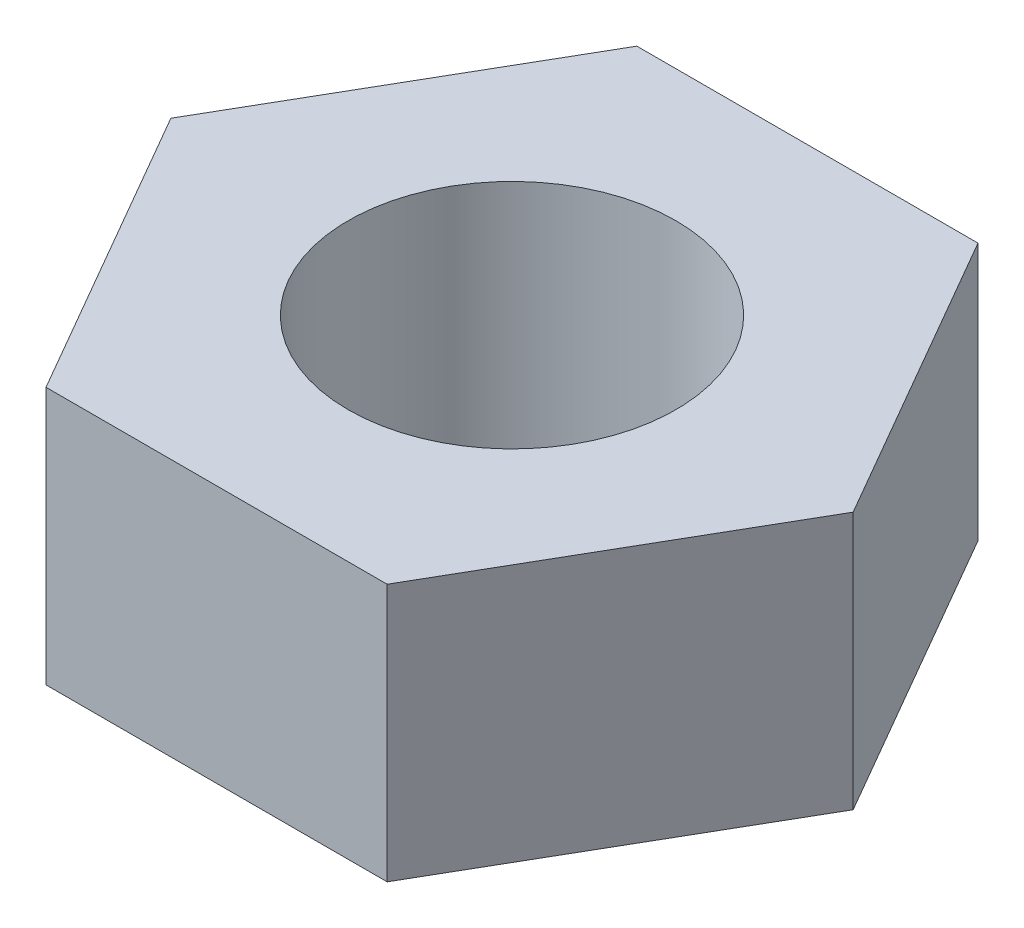
ISO-10303-21;
HEADER;
FILE_DESCRIPTION(('STEP AP214'),'2;1');
FILE_NAME('part.step','',(''),(''),'','','');
FILE_SCHEMA(('AUTOMOTIVE_DESIGN { 1 0 10303 214 1 1 1 1 }'));
ENDSEC;
DATA;
#1=APPLICATION_CONTEXT('core data for automotive mechanical design processes');
#2=APPLICATION_PROTOCOL_DEFINITION('international standard','automotive_design',2000,#1);
#3=PRODUCT_CONTEXT('',#1,'mechanical');
#4=PRODUCT('Part','Part','',(#3));
#5=PRODUCT_RELATED_PRODUCT_CATEGORY('part','',(#4));
#6=PRODUCT_DEFINITION_FORMATION('','',#4);
#7=PRODUCT_DEFINITION_CONTEXT('part definition',#1,'design');
#8=PRODUCT_DEFINITION('design','',#6,#7);
#9=PRODUCT_DEFINITION_SHAPE('','',#8);
#10=(LENGTH_UNIT() NAMED_UNIT(*) SI_UNIT(.MILLI.,.METRE.));
#11=(NAMED_UNIT(*) PLANE_ANGLE_UNIT() SI_UNIT($,.RADIAN.));
#12=(NAMED_UNIT(*) SI_UNIT($,.STERADIAN.) SOLID_ANGLE_UNIT());
#13=UNCERTAINTY_MEASURE_WITH_UNIT(LENGTH_MEASURE(1.E-05),#10,'distance_accuracy_value','');
#14=(GEOMETRIC_REPRESENTATION_CONTEXT(3) GLOBAL_UNCERTAINTY_ASSIGNED_CONTEXT((#13)) GLOBAL_UNIT_ASSIGNED_CONTEXT((#10,
#11,#12)) REPRESENTATION_CONTEXT('',''));
#15=CARTESIAN_POINT('',(0.,0.,0.));
#16=DIRECTION('',(0.,0.,1.));
#17=DIRECTION('',(1.,0.,0.));
#18=AXIS2_PLACEMENT_3D('',#15,#16,#17);
#19=CARTESIAN_POINT('',(0.,2.36,0.));
#20=DIRECTION('',(0.,1.,0.));
#21=DIRECTION('',(0.,0.,1.));
#22=AXIS2_PLACEMENT_3D('',#19,#20,#21);
#23=PLANE('',#22);
#24=DIRECTION('',(0.499999999999995,0.,-0.866025403784442));
#25=VECTOR('',#24,1.);
#26=CARTESIAN_POINT('',(1.56173247815793,2.36,2.70500000000005));
#27=LINE('',#26,#25);
#28=CARTESIAN_POINT('',(1.56173247815793,2.36,2.70500000000005));
#29=VERTEX_POINT('',#28);
#30=CARTESIAN_POINT('',(3.12346495631588,2.36,0.));
#31=VERTEX_POINT('',#30);
#32=EDGE_CURVE('E133',#29,#31,#27,.T.);
#33=ORIENTED_EDGE('',*,*,#32,.T.);
#34=DIRECTION('',(-0.500000000000015,0.,-0.86602540378443));
#35=VECTOR('',#34,1.);
#36=CARTESIAN_POINT('',(3.12346495631588,2.36,0.));
#37=LINE('',#36,#35);
#38=CARTESIAN_POINT('',(1.5617324781579,2.36,-2.70499999999996));
#39=VERTEX_POINT('',#38);
#40=EDGE_CURVE('E91',#31,#39,#37,.T.);
#41=ORIENTED_EDGE('',*,*,#40,.T.);
#42=DIRECTION('',(-1.,0.,0.));
#43=VECTOR('',#42,1.);
#44=CARTESIAN_POINT('',(1.5617324781579,2.36,-2.70499999999996));
#45=LINE('',#44,#43);
#46=CARTESIAN_POINT('',(-1.56173247815798,2.36,-2.70499999999996));
#47=VERTEX_POINT('',#46);
#48=EDGE_CURVE('E104',#39,#47,#45,.T.);
#49=ORIENTED_EDGE('',*,*,#48,.T.);
#50=DIRECTION('',(-0.499999999999995,0.,0.866025403784441));
#51=VECTOR('',#50,1.);
#52=CARTESIAN_POINT('',(-1.56173247815798,2.36,-2.70499999999996));
#53=LINE('',#52,#51);
#54=CARTESIAN_POINT('',(-3.12346495631588,2.36,0.));
#55=VERTEX_POINT('',#54);
#56=EDGE_CURVE('E98',#47,#55,#53,.T.);
#57=ORIENTED_EDGE('',*,*,#56,.T.);
#58=DIRECTION('',(0.5,0.,0.866025403784439));
#59=VECTOR('',#58,1.);
#60=CARTESIAN_POINT('',(-3.12346495631588,2.36,0.));
#61=LINE('',#60,#59);
#62=CARTESIAN_POINT('',(-1.56173247815794,2.36,2.705));
#63=VERTEX_POINT('',#62);
#64=EDGE_CURVE('E102',#55,#63,#61,.T.);
#65=ORIENTED_EDGE('',*,*,#64,.T.);
#66=DIRECTION('',(1.,0.,0.));
#67=VECTOR('',#66,1.);
#68=CARTESIAN_POINT('',(-1.56173247815794,2.36,2.705));
#69=LINE('',#68,#67);
#70=EDGE_CURVE('E54',#63,#29,#69,.T.);
#71=ORIENTED_EDGE('',*,*,#70,.T.);
#72=EDGE_LOOP('',(#33,#41,#49,#57,#65,#71));
#73=FACE_BOUND('',#72,.T.);
#74=CARTESIAN_POINT('',(0.,2.36,0.));
#75=DIRECTION('',(0.,1.,0.));
#76=DIRECTION('',(0.,0.,1.));
#77=AXIS2_PLACEMENT_3D('',#74,#75,#76);
#78=CIRCLE('',#77,1.5);
#79=CARTESIAN_POINT('',(0.,2.36,-1.5));
#80=VERTEX_POINT('',#79);
#81=EDGE_CURVE('E126',#80,#80,#78,.T.);
#82=ORIENTED_EDGE('',*,*,#81,.F.);
#83=EDGE_LOOP('',(#82));
#84=FACE_BOUND('',#83,.T.);
#85=ADVANCED_FACE('F37',(#73,#84),#23,.T.);
#86=CARTESIAN_POINT('',(0.,0.,0.));
#87=DIRECTION('',(0.,1.,0.));
#88=DIRECTION('',(0.,0.,1.));
#89=AXIS2_PLACEMENT_3D('',#86,#87,#88);
#90=PLANE('',#89);
#91=DIRECTION('',(0.499999999999995,0.,-0.866025403784442));
#92=VECTOR('',#91,1.);
#93=CARTESIAN_POINT('',(1.56173247815793,0.,2.70500000000005));
#94=LINE('',#93,#92);
#95=CARTESIAN_POINT('',(1.56173247815793,0.,2.70500000000005));
#96=VERTEX_POINT('',#95);
#97=CARTESIAN_POINT('',(3.12346495631588,0.,0.));
#98=VERTEX_POINT('',#97);
#99=EDGE_CURVE('E122',#96,#98,#94,.T.);
#100=ORIENTED_EDGE('',*,*,#99,.F.);
#101=DIRECTION('',(1.,0.,0.));
#102=VECTOR('',#101,1.);
#103=CARTESIAN_POINT('',(-1.56173247815794,0.,2.705));
#104=LINE('',#103,#102);
#105=CARTESIAN_POINT('',(-1.56173247815794,0.,2.705));
#106=VERTEX_POINT('',#105);
#107=EDGE_CURVE('E83',#106,#96,#104,.T.);
#108=ORIENTED_EDGE('',*,*,#107,.F.);
#109=DIRECTION('',(0.5,0.,0.866025403784439));
#110=VECTOR('',#109,1.);
#111=CARTESIAN_POINT('',(-3.12346495631588,0.,0.));
#112=LINE('',#111,#110);
#113=CARTESIAN_POINT('',(-3.12346495631588,0.,0.));
#114=VERTEX_POINT('',#113);
#115=EDGE_CURVE('E77',#114,#106,#112,.T.);
#116=ORIENTED_EDGE('',*,*,#115,.F.);
#117=DIRECTION('',(-0.499999999999995,0.,0.866025403784441));
#118=VECTOR('',#117,1.);
#119=CARTESIAN_POINT('',(-1.56173247815798,0.,-2.70499999999996));
#120=LINE('',#119,#118);
#121=CARTESIAN_POINT('',(-1.56173247815798,0.,-2.70499999999996));
#122=VERTEX_POINT('',#121);
#123=EDGE_CURVE('E112',#122,#114,#120,.T.);
#124=ORIENTED_EDGE('',*,*,#123,.F.);
#125=DIRECTION('',(-1.,0.,0.));
#126=VECTOR('',#125,1.);
#127=CARTESIAN_POINT('',(1.5617324781579,0.,-2.70499999999996));
#128=LINE('',#127,#126);
#129=CARTESIAN_POINT('',(1.5617324781579,0.,-2.70499999999996));
#130=VERTEX_POINT('',#129);
#131=EDGE_CURVE('E128',#130,#122,#128,.T.);
#132=ORIENTED_EDGE('',*,*,#131,.F.);
#133=DIRECTION('',(-0.500000000000015,0.,-0.86602540378443));
#134=VECTOR('',#133,1.);
#135=CARTESIAN_POINT('',(3.12346495631588,0.,0.));
#136=LINE('',#135,#134);
#137=EDGE_CURVE('E125',#98,#130,#136,.T.);
#138=ORIENTED_EDGE('',*,*,#137,.F.);
#139=EDGE_LOOP('',(#100,#108,#116,#124,#132,#138));
#140=FACE_BOUND('',#139,.T.);
#141=CARTESIAN_POINT('',(0.,0.,0.));
#142=DIRECTION('',(0.,1.,0.));
#143=DIRECTION('',(0.,0.,1.));
#144=AXIS2_PLACEMENT_3D('',#141,#142,#143);
#145=CIRCLE('',#144,1.5);
#146=CARTESIAN_POINT('',(0.,0.,-1.5));
#147=VERTEX_POINT('',#146);
#148=EDGE_CURVE('E244',#147,#147,#145,.T.);
#149=ORIENTED_EDGE('',*,*,#148,.T.);
#150=EDGE_LOOP('',(#149));
#151=FACE_BOUND('',#150,.T.);
#152=ADVANCED_FACE('F142',(#140,#151),#90,.F.);
#153=CARTESIAN_POINT('',(1.56173247815793,2.36,2.70500000000005));
#154=DIRECTION('',(-0.866025403784441,0.,-0.499999999999995));
#155=DIRECTION('',(-0.499999999999995,0.,0.866025403784441));
#156=AXIS2_PLACEMENT_3D('',#153,#154,#155);
#157=PLANE('',#156);
#158=ORIENTED_EDGE('',*,*,#99,.T.);
#159=DIRECTION('',(0.,-1.,0.));
#160=VECTOR('',#159,1.);
#161=CARTESIAN_POINT('',(3.12346495631588,2.36,0.));
#162=LINE('',#161,#160);
#163=EDGE_CURVE('E11',#31,#98,#162,.T.);
#164=ORIENTED_EDGE('',*,*,#163,.F.);
#165=ORIENTED_EDGE('',*,*,#32,.F.);
#166=DIRECTION('',(0.,-1.,0.));
#167=VECTOR('',#166,1.);
#168=CARTESIAN_POINT('',(1.56173247815793,2.36,2.70500000000005));
#169=LINE('',#168,#167);
#170=EDGE_CURVE('E118',#29,#96,#169,.T.);
#171=ORIENTED_EDGE('',*,*,#170,.T.);
#172=EDGE_LOOP('',(#158,#164,#165,#171));
#173=FACE_BOUND('',#172,.T.);
#174=ADVANCED_FACE('F39',(#173),#157,.F.);
#175=CARTESIAN_POINT('',(3.12346495631588,2.36,0.));
#176=DIRECTION('',(-0.86602540378443,0.,0.500000000000015));
#177=DIRECTION('',(0.500000000000015,0.,0.86602540378443));
#178=AXIS2_PLACEMENT_3D('',#175,#176,#177);
#179=PLANE('',#178);
#180=ORIENTED_EDGE('',*,*,#137,.T.);
#181=DIRECTION('',(0.,-1.,0.));
#182=VECTOR('',#181,1.);
#183=CARTESIAN_POINT('',(1.5617324781579,2.36,-2.70499999999996));
#184=LINE('',#183,#182);
#185=EDGE_CURVE('E46',#39,#130,#184,.T.);
#186=ORIENTED_EDGE('',*,*,#185,.F.);
#187=ORIENTED_EDGE('',*,*,#40,.F.);
#188=ORIENTED_EDGE('',*,*,#163,.T.);
#189=EDGE_LOOP('',(#180,#186,#187,#188));
#190=FACE_BOUND('',#189,.T.);
#191=ADVANCED_FACE('F167',(#190),#179,.F.);
#192=CARTESIAN_POINT('',(1.5617324781579,2.36,-2.70499999999996));
#193=DIRECTION('',(0.,0.,1.));
#194=DIRECTION('',(1.,0.,0.));
#195=AXIS2_PLACEMENT_3D('',#192,#193,#194);
#196=PLANE('',#195);
#197=ORIENTED_EDGE('',*,*,#131,.T.);
#198=DIRECTION('',(0.,-1.,0.));
#199=VECTOR('',#198,1.);
#200=CARTESIAN_POINT('',(-1.56173247815798,2.36,-2.70499999999996));
#201=LINE('',#200,#199);
#202=EDGE_CURVE('E113',#47,#122,#201,.T.);
#203=ORIENTED_EDGE('',*,*,#202,.F.);
#204=ORIENTED_EDGE('',*,*,#48,.F.);
#205=ORIENTED_EDGE('',*,*,#185,.T.);
#206=EDGE_LOOP('',(#197,#203,#204,#205));
#207=FACE_BOUND('',#206,.T.);
#208=ADVANCED_FACE('F139',(#207),#196,.F.);
#209=CARTESIAN_POINT('',(-1.56173247815798,2.36,-2.70499999999996));
#210=DIRECTION('',(0.866025403784441,0.,0.499999999999995));
#211=DIRECTION('',(0.499999999999995,0.,-0.866025403784441));
#212=AXIS2_PLACEMENT_3D('',#209,#210,#211);
#213=PLANE('',#212);
#214=ORIENTED_EDGE('',*,*,#123,.T.);
#215=DIRECTION('',(0.,-1.,0.));
#216=VECTOR('',#215,1.);
#217=CARTESIAN_POINT('',(-3.12346495631588,2.36,0.));
#218=LINE('',#217,#216);
#219=EDGE_CURVE('E109',#55,#114,#218,.T.);
#220=ORIENTED_EDGE('',*,*,#219,.F.);
#221=ORIENTED_EDGE('',*,*,#56,.F.);
#222=ORIENTED_EDGE('',*,*,#202,.T.);
#223=EDGE_LOOP('',(#214,#220,#221,#222));
#224=FACE_BOUND('',#223,.T.);
#225=ADVANCED_FACE('F110',(#224),#213,.F.);
#226=CARTESIAN_POINT('',(-3.12346495631588,2.36,0.));
#227=DIRECTION('',(0.866025403784439,0.,-0.5));
#228=DIRECTION('',(-0.5,0.,-0.866025403784439));
#229=AXIS2_PLACEMENT_3D('',#226,#227,#228);
#230=PLANE('',#229);
#231=ORIENTED_EDGE('',*,*,#115,.T.);
#232=DIRECTION('',(0.,-1.,0.));
#233=VECTOR('',#232,1.);
#234=CARTESIAN_POINT('',(-1.56173247815794,2.36,2.705));
#235=LINE('',#234,#233);
#236=EDGE_CURVE('E114',#63,#106,#235,.T.);
#237=ORIENTED_EDGE('',*,*,#236,.F.);
#238=ORIENTED_EDGE('',*,*,#64,.F.);
#239=ORIENTED_EDGE('',*,*,#219,.T.);
#240=EDGE_LOOP('',(#231,#237,#238,#239));
#241=FACE_BOUND('',#240,.T.);
#242=ADVANCED_FACE('F116',(#241),#230,.F.);
#243=CARTESIAN_POINT('',(-1.56173247815794,2.36,2.705));
#244=DIRECTION('',(0.,0.,-1.));
#245=DIRECTION('',(-1.,0.,0.));
#246=AXIS2_PLACEMENT_3D('',#243,#244,#245);
#247=PLANE('',#246);
#248=ORIENTED_EDGE('',*,*,#107,.T.);
#249=ORIENTED_EDGE('',*,*,#170,.F.);
#250=ORIENTED_EDGE('',*,*,#70,.F.);
#251=ORIENTED_EDGE('',*,*,#236,.T.);
#252=EDGE_LOOP('',(#248,#249,#250,#251));
#253=FACE_BOUND('',#252,.T.);
#254=ADVANCED_FACE('F147',(#253),#247,.F.);
#255=CARTESIAN_POINT('',(0.,2.36,0.));
#256=DIRECTION('',(0.,-1.,0.));
#257=DIRECTION('',(0.,0.,-1.));
#258=AXIS2_PLACEMENT_3D('',#255,#256,#257);
#259=CYLINDRICAL_SURFACE('',#258,1.5);
#260=CARTESIAN_POINT('',(0.,2.36,-1.5));
#261=CARTESIAN_POINT('',(0.,2.33541666666667,-1.5));
#262=CARTESIAN_POINT('',(0.,2.31083333333333,-1.5));
#263=CARTESIAN_POINT('',(0.,2.26166666666667,-1.5));
#264=CARTESIAN_POINT('',(0.,2.23708333333333,-1.5));
#265=CARTESIAN_POINT('',(0.,2.18791666666667,-1.5));
#266=CARTESIAN_POINT('',(0.,2.16333333333333,-1.5));
#267=CARTESIAN_POINT('',(0.,2.11416666666667,-1.5));
#268=CARTESIAN_POINT('',(0.,2.08958333333333,-1.5));
#269=CARTESIAN_POINT('',(0.,2.04041666666667,-1.5));
#270=CARTESIAN_POINT('',(0.,2.01583333333333,-1.5));
#271=CARTESIAN_POINT('',(0.,1.96666666666667,-1.5));
#272=CARTESIAN_POINT('',(0.,1.94208333333333,-1.5));
#273=CARTESIAN_POINT('',(0.,1.89291666666667,-1.5));
#274=CARTESIAN_POINT('',(0.,1.86833333333333,-1.5));
#275=CARTESIAN_POINT('',(0.,1.81916666666667,-1.5));
#276=CARTESIAN_POINT('',(0.,1.79458333333333,-1.5));
#277=CARTESIAN_POINT('',(0.,1.74541666666667,-1.5));
#278=CARTESIAN_POINT('',(0.,1.72083333333333,-1.5));
#279=CARTESIAN_POINT('',(0.,1.67166666666667,-1.5));
#280=CARTESIAN_POINT('',(0.,1.64708333333333,-1.5));
#281=CARTESIAN_POINT('',(0.,1.59791666666667,-1.5));
#282=CARTESIAN_POINT('',(0.,1.57333333333333,-1.5));
#283=CARTESIAN_POINT('',(0.,1.52416666666667,-1.5));
#284=CARTESIAN_POINT('',(0.,1.49958333333333,-1.5));
#285=CARTESIAN_POINT('',(0.,1.45041666666667,-1.5));
#286=CARTESIAN_POINT('',(0.,1.42583333333333,-1.5));
#287=CARTESIAN_POINT('',(0.,1.37666666666667,-1.5));
#288=CARTESIAN_POINT('',(0.,1.35208333333333,-1.5));
#289=CARTESIAN_POINT('',(0.,1.30291666666667,-1.5));
#290=CARTESIAN_POINT('',(0.,1.27833333333333,-1.5));
#291=CARTESIAN_POINT('',(0.,1.22916666666667,-1.5));
#292=CARTESIAN_POINT('',(0.,1.20458333333333,-1.5));
#293=CARTESIAN_POINT('',(0.,1.15541666666667,-1.5));
#294=CARTESIAN_POINT('',(0.,1.13083333333333,-1.5));
#295=CARTESIAN_POINT('',(0.,1.08166666666667,-1.5));
#296=CARTESIAN_POINT('',(0.,1.05708333333333,-1.5));
#297=CARTESIAN_POINT('',(0.,1.00791666666667,-1.5));
#298=CARTESIAN_POINT('',(0.,0.983333333333333,-1.5));
#299=CARTESIAN_POINT('',(0.,0.934166666666667,-1.5));
#300=CARTESIAN_POINT('',(0.,0.909583333333333,-1.5));
#301=CARTESIAN_POINT('',(0.,0.860416666666667,-1.5));
#302=CARTESIAN_POINT('',(0.,0.835833333333333,-1.5));
#303=CARTESIAN_POINT('',(0.,0.786666666666667,-1.5));
#304=CARTESIAN_POINT('',(0.,0.762083333333333,-1.5));
#305=CARTESIAN_POINT('',(0.,0.712916666666667,-1.5));
#306=CARTESIAN_POINT('',(0.,0.688333333333333,-1.5));
#307=CARTESIAN_POINT('',(0.,0.639166666666666,-1.5));
#308=CARTESIAN_POINT('',(0.,0.614583333333333,-1.5));
#309=CARTESIAN_POINT('',(0.,0.565416666666666,-1.5));
#310=CARTESIAN_POINT('',(0.,0.540833333333333,-1.5));
#311=CARTESIAN_POINT('',(0.,0.491666666666666,-1.5));
#312=CARTESIAN_POINT('',(0.,0.467083333333333,-1.5));
#313=CARTESIAN_POINT('',(0.,0.417916666666667,-1.5));
#314=CARTESIAN_POINT('',(0.,0.393333333333333,-1.5));
#315=CARTESIAN_POINT('',(0.,0.344166666666667,-1.5));
#316=CARTESIAN_POINT('',(0.,0.319583333333333,-1.5));
#317=CARTESIAN_POINT('',(0.,0.270416666666667,-1.5));
#318=CARTESIAN_POINT('',(0.,0.245833333333333,-1.5));
#319=CARTESIAN_POINT('',(0.,0.196666666666667,-1.5));
#320=CARTESIAN_POINT('',(0.,0.172083333333333,-1.5));
#321=CARTESIAN_POINT('',(0.,0.122916666666667,-1.5));
#322=CARTESIAN_POINT('',(0.,0.0983333333333334,-1.5));
#323=CARTESIAN_POINT('',(0.,0.0491666666666667,-1.5));
#324=CARTESIAN_POINT('',(0.,0.0245833333333333,-1.5));
#325=CARTESIAN_POINT('',(0.,0.,-1.5));
#326=B_SPLINE_CURVE_WITH_KNOTS('',3,(#260,#261,#262,#263,#264,#265,#266,#267,#268,#269,#270,
#271,#272,#273,#274,#275,#276,#277,#278,#279,#280,#281,#282,#283,#284,#285,#286,#287,#288,#289,
#290,#291,#292,#293,#294,#295,#296,#297,#298,#299,#300,#301,#302,#303,#304,#305,#306,#307,#308,
#309,#310,#311,#312,#313,#314,#315,#316,#317,#318,#319,#320,#321,#322,#323,#324,#325),
.UNSPECIFIED.,.F.,.F.,(4,2,2,2,2,2,2,2,2,2,2,2,2,2,2,2,2,2,2,2,2,2,2,2,2,2,2,2,2,2,2,2,4),(0.,
0.07375,0.1475,0.22125,0.295,0.36875,0.4425,0.51625,0.59,0.66375,0.7375,0.81125,0.885,0.95875,
1.0325,1.10625,1.18,1.25375,1.3275,1.40125,1.475,1.54875,1.6225,1.69625,1.77,1.84375,1.9175,
1.99125,2.065,2.13875,2.2125,2.28625,2.36),.UNSPECIFIED.);
#327=EDGE_CURVE('BSEAM149',#80,#147,#326,.T.);
#328=ORIENTED_EDGE('',*,*,#81,.T.);
#329=ORIENTED_EDGE('',*,*,#148,.F.);
#330=ORIENTED_EDGE('',*,*,#327,.T.);
#331=ORIENTED_EDGE('',*,*,#327,.F.);
#332=EDGE_LOOP('',(#328,#330,#329,#331));
#333=FACE_BOUND('',#332,.T.);
#334=ADVANCED_FACE('F149',(#333),#259,.F.);
#335=CLOSED_SHELL('',(#85,#152,#174,#191,#208,#225,#242,#254,#334));
#336=MANIFOLD_SOLID_BREP('B2',#335);
#337=ADVANCED_BREP_SHAPE_REPRESENTATION('',(#18,#336),#14);
#338=SHAPE_DEFINITION_REPRESENTATION(#9,#337);
ENDSEC;
END-ISO-10303-21;
